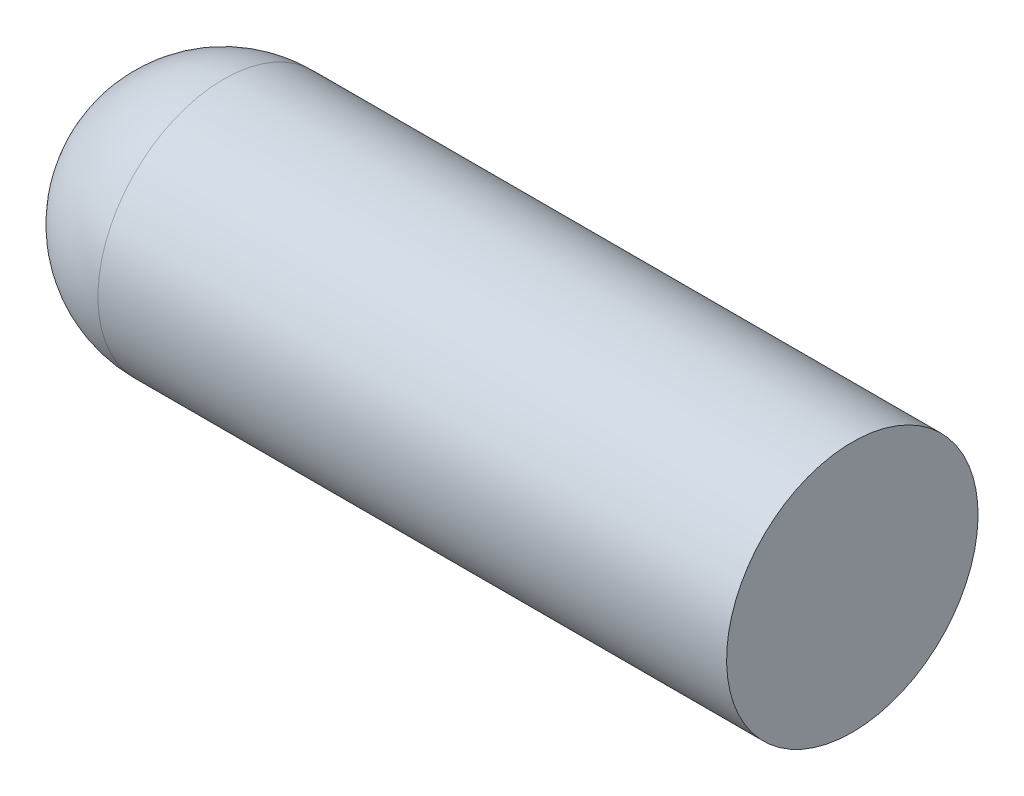
ISO-10303-21;
HEADER;
FILE_DESCRIPTION(('STEP AP214'),'2;1');
FILE_NAME('part.step','',(''),(''),'','','');
FILE_SCHEMA(('AUTOMOTIVE_DESIGN { 1 0 10303 214 1 1 1 1 }'));
ENDSEC;
DATA;
#1=APPLICATION_CONTEXT('core data for automotive mechanical design processes');
#2=APPLICATION_PROTOCOL_DEFINITION('international standard','automotive_design',2000,#1);
#3=PRODUCT_CONTEXT('',#1,'mechanical');
#4=PRODUCT('Part','Part','',(#3));
#5=PRODUCT_RELATED_PRODUCT_CATEGORY('part','',(#4));
#6=PRODUCT_DEFINITION_FORMATION('','',#4);
#7=PRODUCT_DEFINITION_CONTEXT('part definition',#1,'design');
#8=PRODUCT_DEFINITION('design','',#6,#7);
#9=PRODUCT_DEFINITION_SHAPE('','',#8);
#10=(LENGTH_UNIT() NAMED_UNIT(*) SI_UNIT(.MILLI.,.METRE.));
#11=(NAMED_UNIT(*) PLANE_ANGLE_UNIT() SI_UNIT($,.RADIAN.));
#12=(NAMED_UNIT(*) SI_UNIT($,.STERADIAN.) SOLID_ANGLE_UNIT());
#13=UNCERTAINTY_MEASURE_WITH_UNIT(LENGTH_MEASURE(1.E-05),#10,'distance_accuracy_value','');
#14=(GEOMETRIC_REPRESENTATION_CONTEXT(3) GLOBAL_UNCERTAINTY_ASSIGNED_CONTEXT((#13)) GLOBAL_UNIT_ASSIGNED_CONTEXT((#10,
#11,#12)) REPRESENTATION_CONTEXT('',''));
#15=CARTESIAN_POINT('',(0.,0.,0.));
#16=DIRECTION('',(0.,0.,1.));
#17=DIRECTION('',(1.,0.,0.));
#18=AXIS2_PLACEMENT_3D('',#15,#16,#17);
#19=CARTESIAN_POINT('',(0.,0.,0.));
#20=DIRECTION('',(-1.,0.,0.));
#21=DIRECTION('',(0.,1.,0.));
#22=AXIS2_PLACEMENT_3D('',#19,#20,#21);
#23=SPHERICAL_SURFACE('',#22,762.);
#24=CARTESIAN_POINT('',(3.8599499485592E-05,-8.32667258627057E-13,0.));
#25=DIRECTION('',(-1.,0.,0.));
#26=DIRECTION('',(0.,-1.,0.));
#27=AXIS2_PLACEMENT_3D('',#24,#25,#26);
#28=CIRCLE('',#27,762.000000000001);
#29=CARTESIAN_POINT('',(3.85994996521255E-05,-762.000000000002,0.));
#30=VERTEX_POINT('',#29);
#31=EDGE_CURVE('E79',#30,#30,#28,.T.);
#32=ORIENTED_EDGE('',*,*,#31,.T.);
#33=EDGE_LOOP('',(#32));
#34=FACE_BOUND('',#33,.T.);
#35=ADVANCED_FACE('F73',(#34),#23,.T.);
#36=CARTESIAN_POINT('',(3809.9999614005,0.,0.));
#37=DIRECTION('',(-1.,0.,0.));
#38=DIRECTION('',(0.,-1.,0.));
#39=AXIS2_PLACEMENT_3D('',#36,#37,#38);
#40=PLANE('',#39);
#41=CARTESIAN_POINT('',(3809.9999614005,0.,0.));
#42=DIRECTION('',(-1.,0.,0.));
#43=DIRECTION('',(0.,-1.,0.));
#44=AXIS2_PLACEMENT_3D('',#41,#42,#43);
#45=CIRCLE('',#44,762.);
#46=CARTESIAN_POINT('',(3809.9999614005,-762.,0.));
#47=VERTEX_POINT('',#46);
#48=EDGE_CURVE('E12',#47,#47,#45,.T.);
#49=ORIENTED_EDGE('',*,*,#48,.F.);
#50=EDGE_LOOP('',(#49));
#51=FACE_BOUND('',#50,.T.);
#52=ADVANCED_FACE('F107',(#51),#40,.F.);
#53=CARTESIAN_POINT('',(-762.,-9.99200722162641E-13,0.));
#54=DIRECTION('',(-1.,0.,0.));
#55=DIRECTION('',(0.,-1.,0.));
#56=AXIS2_PLACEMENT_3D('',#53,#54,#55);
#57=CYLINDRICAL_SURFACE('',#56,762.);
#58=ORIENTED_EDGE('',*,*,#31,.F.);
#59=EDGE_LOOP('',(#58));
#60=FACE_BOUND('',#59,.T.);
#61=ORIENTED_EDGE('',*,*,#48,.T.);
#62=EDGE_LOOP('',(#61));
#63=FACE_BOUND('',#62,.T.);
#64=ADVANCED_FACE('F104',(#60,#63),#57,.T.);
#65=CLOSED_SHELL('',(#35,#52,#64));
#66=CARTESIAN_POINT('',(762.,78.359,0.));
#67=DIRECTION('',(1.,0.,0.));
#68=DIRECTION('',(0.,1.,0.));
#69=AXIS2_PLACEMENT_3D('',#66,#67,#68);
#70=PLANE('',#69);
#71=CARTESIAN_POINT('',(762.,0.,0.));
#72=DIRECTION('',(1.,0.,0.));
#73=DIRECTION('',(0.,1.,0.));
#74=AXIS2_PLACEMENT_3D('',#71,#72,#73);
#75=CIRCLE('',#74,78.3589999999999);
#76=CARTESIAN_POINT('',(762.,78.359,0.));
#77=VERTEX_POINT('',#76);
#78=EDGE_CURVE('E92',#77,#77,#75,.T.);
#79=ORIENTED_EDGE('',*,*,#78,.F.);
#80=EDGE_LOOP('',(#79));
#81=FACE_BOUND('',#80,.T.);
#82=ADVANCED_FACE('F116',(#81),#70,.F.);
#83=CARTESIAN_POINT('',(508.,0.,0.));
#84=DIRECTION('',(1.,0.,0.));
#85=DIRECTION('',(0.,1.,0.));
#86=AXIS2_PLACEMENT_3D('',#83,#84,#85);
#87=CYLINDRICAL_SURFACE('',#86,78.359);
#88=CARTESIAN_POINT('',(508.,0.,0.));
#89=DIRECTION('',(1.,0.,0.));
#90=DIRECTION('',(0.,1.,0.));
#91=AXIS2_PLACEMENT_3D('',#88,#89,#90);
#92=CIRCLE('',#91,78.359);
#93=CARTESIAN_POINT('',(508.,78.3590000000001,0.));
#94=VERTEX_POINT('',#93);
#95=EDGE_CURVE('E90',#94,#94,#92,.T.);
#96=ORIENTED_EDGE('',*,*,#95,.F.);
#97=EDGE_LOOP('',(#96));
#98=FACE_BOUND('',#97,.T.);
#99=ORIENTED_EDGE('',*,*,#78,.T.);
#100=EDGE_LOOP('',(#99));
#101=FACE_BOUND('',#100,.T.);
#102=ADVANCED_FACE('F85',(#98,#101),#87,.F.);
#103=CARTESIAN_POINT('',(508.,78.3590000000001,0.));
#104=CARTESIAN_POINT('',(506.466506538912,78.3533865527715,0.));
#105=CARTESIAN_POINT('',(503.399758723359,78.3100117012018,0.));
#106=CARTESIAN_POINT('',(497.267203511275,78.1743864260999,0.));
#107=CARTESIAN_POINT('',(487.103143355491,77.8358657900895,0.));
#108=CARTESIAN_POINT('',(474.443672774575,77.2780067172111,0.));
#109=CARTESIAN_POINT('',(455.262955994451,76.2291909569819,0.));
#110=CARTESIAN_POINT('',(431.103668314105,74.6062080892274,0.));
#111=CARTESIAN_POINT('',(402.94385311939,72.3578215514989,0.));
#112=CARTESIAN_POINT('',(370.797101621952,69.3748151553989,0.));
#113=CARTESIAN_POINT('',(338.687218842144,66.019317565241,0.));
#114=CARTESIAN_POINT('',(306.615943820824,62.3133300043452,0.));
#115=CARTESIAN_POINT('',(274.5859325591,58.266356780265,0.));
#116=CARTESIAN_POINT('',(242.600940750101,53.8774969176258,0.));
#117=CARTESIAN_POINT('',(210.666331668604,49.1355934479414,0.));
#118=CARTESIAN_POINT('',(178.789638073683,44.0179331187811,0.));
#119=CARTESIAN_POINT('',(146.982116690261,38.4855220067455,0.));
#120=CARTESIAN_POINT('',(115.260857412618,32.4757689162783,0.));
#121=CARTESIAN_POINT('',(87.8428395219212,26.7555486962024,0.));
#122=CARTESIAN_POINT('',(64.7152060778741,21.4391039022628,0.));
#123=CARTESIAN_POINT('',(45.6256865676283,16.5950074599223,0.));
#124=CARTESIAN_POINT('',(31.8916232950011,12.776951202506,0.));
#125=CARTESIAN_POINT('',(20.431057710862,9.21610765332269,0.));
#126=CARTESIAN_POINT('',(11.8911471469212,6.1625292191336,0.));
#127=CARTESIAN_POINT('',(6.79215333620263,4.0533986101978,0.));
#128=CARTESIAN_POINT('',(3.92621998198972,2.6863652404464,0.));
#129=CARTESIAN_POINT('',(2.34218930804693,1.82185431551123,0.));
#130=CARTESIAN_POINT('',(1.44479441679255,1.26705539215756,0.));
#131=CARTESIAN_POINT('',(0.914446885529836,0.898448081037935,0.));
#132=CARTESIAN_POINT('',(0.602624186039401,0.656685654001427,0.));
#133=CARTESIAN_POINT('',(0.401947451603214,0.484306452729949,0.));
#134=CARTESIAN_POINT('',(0.274835356304458,0.363880791177356,0.));
#135=CARTESIAN_POINT('',(0.189812425286261,0.276067495807433,0.));
#136=CARTESIAN_POINT('',(0.119222388262843,0.195375450701481,0.));
#137=CARTESIAN_POINT('',(0.069784833025893,0.13164667774908,0.));
#138=CARTESIAN_POINT('',(0.03150232088995,0.0740170241349496,0.));
#139=CARTESIAN_POINT('',(0.0101037601756575,0.0330289794366481,0.));
#140=CARTESIAN_POINT('',(0.00282201094841929,0.0112206817663937,0.));
#141=CARTESIAN_POINT('',(0.,0.,0.));
#142=B_SPLINE_CURVE_WITH_KNOTS('',4,(#103,#104,#105,#106,#107,#108,#109,#110,#111,#112,#113,
#114,#115,#116,#117,#118,#119,#120,#121,#122,#123,#124,#125,#126,#127,#128,#129,#130,#131,#132,
#133,#134,#135,#136,#137,#138,#139,#140,#141),.UNSPECIFIED.,.F.,.F.,(5,1,1,1,1,1,1,1,1,1,1,1,1,
1,1,1,1,1,1,1,1,1,1,1,1,1,1,1,1,1,1,1,1,1,1,5),(0.,0.0118867171331606,0.0237734342663212,
0.0475468685326423,0.0788277031398661,0.11010853774709,0.17267020713405,0.235231877354637,
0.297793547291981,0.360355215303574,0.422916887074998,0.485478553803714,0.548040224137599,
0.610601894958506,0.67316356249182,0.735725231832568,0.798286900585068,0.860848559503119,
0.890252526568773,0.919656493634427,0.950937311025142,0.971332253827268,0.983254549434079,
0.989933318504825,0.993691635677172,0.995933780005993,0.997236088462219,0.998107592058293,
0.998695814465024,0.998990858832321,0.999285903199619,0.999464427399714,0.99964295159981,
0.999821475799905,0.999910737899952,1.),.UNSPECIFIED.);
#143=CARTESIAN_POINT('',(508.,0.,0.));
#144=DIRECTION('',(1.,0.,0.));
#145=AXIS1_PLACEMENT('',#143,#144);
#146=SURFACE_OF_REVOLUTION('',#142,#145);
#147=CARTESIAN_POINT('',(0.,0.,0.));
#148=VERTEX_POINT('',#147);
#149=VERTEX_LOOP('',#148);
#150=FACE_BOUND('',#149,.T.);
#151=ORIENTED_EDGE('',*,*,#95,.T.);
#152=EDGE_LOOP('',(#151));
#153=FACE_BOUND('',#152,.T.);
#154=ADVANCED_FACE('F82',(#150,#153),#146,.T.);
#155=CLOSED_SHELL('',(#82,#102,#154));
#156=ORIENTED_CLOSED_SHELL('',*,#155,.T.);
#157=BREP_WITH_VOIDS('B2',#65,(#156));
#158=ADVANCED_BREP_SHAPE_REPRESENTATION('',(#18,#157),#14);
#159=SHAPE_DEFINITION_REPRESENTATION(#9,#158);
ENDSEC;
END-ISO-10303-21;
